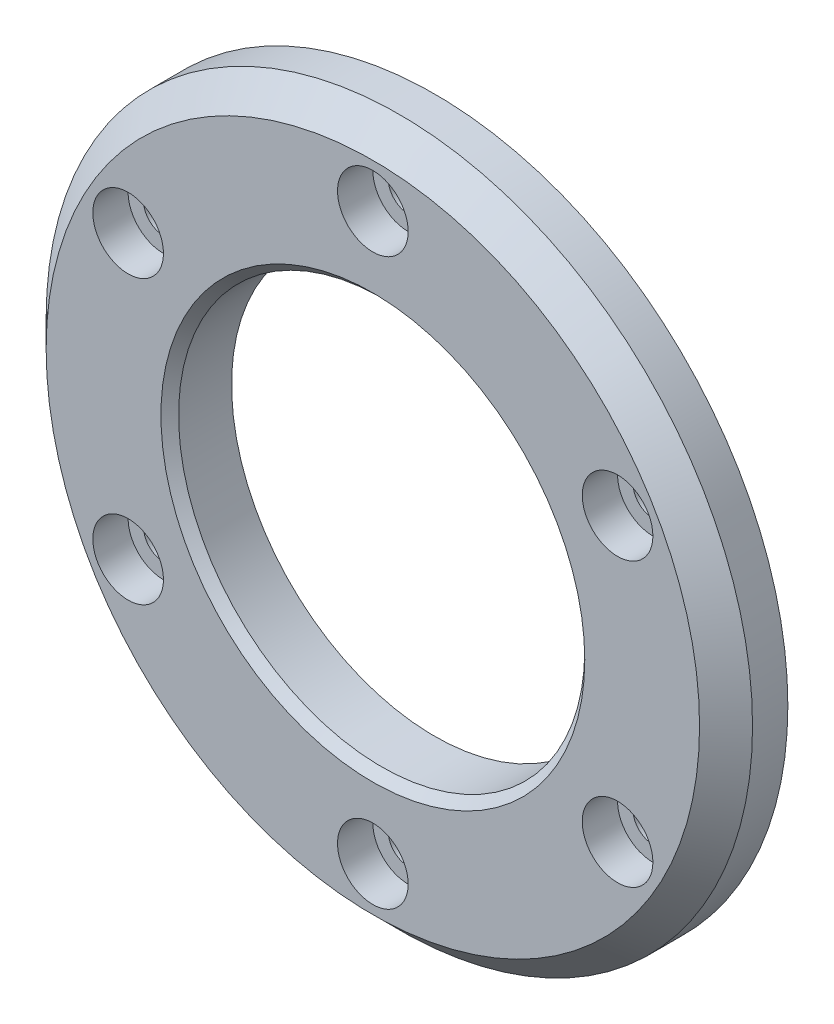
ISO-10303-21;
HEADER;
FILE_DESCRIPTION(('STEP AP214'),'2;1');
FILE_NAME('part.step','',(''),(''),'','','');
FILE_SCHEMA(('AUTOMOTIVE_DESIGN { 1 0 10303 214 1 1 1 1 }'));
ENDSEC;
DATA;
#1=APPLICATION_CONTEXT('core data for automotive mechanical design processes');
#2=APPLICATION_PROTOCOL_DEFINITION('international standard','automotive_design',2000,#1);
#3=PRODUCT_CONTEXT('',#1,'mechanical');
#4=PRODUCT('Part','Part','',(#3));
#5=PRODUCT_RELATED_PRODUCT_CATEGORY('part','',(#4));
#6=PRODUCT_DEFINITION_FORMATION('','',#4);
#7=PRODUCT_DEFINITION_CONTEXT('part definition',#1,'design');
#8=PRODUCT_DEFINITION('design','',#6,#7);
#9=PRODUCT_DEFINITION_SHAPE('','',#8);
#10=(LENGTH_UNIT() NAMED_UNIT(*) SI_UNIT(.MILLI.,.METRE.));
#11=(NAMED_UNIT(*) PLANE_ANGLE_UNIT() SI_UNIT($,.RADIAN.));
#12=(NAMED_UNIT(*) SI_UNIT($,.STERADIAN.) SOLID_ANGLE_UNIT());
#13=UNCERTAINTY_MEASURE_WITH_UNIT(LENGTH_MEASURE(1.E-05),#10,'distance_accuracy_value','');
#14=(GEOMETRIC_REPRESENTATION_CONTEXT(3) GLOBAL_UNCERTAINTY_ASSIGNED_CONTEXT((#13)) GLOBAL_UNIT_ASSIGNED_CONTEXT((#10,
#11,#12)) REPRESENTATION_CONTEXT('',''));
#15=CARTESIAN_POINT('',(0.,0.,0.));
#16=DIRECTION('',(0.,0.,1.));
#17=DIRECTION('',(1.,0.,0.));
#18=AXIS2_PLACEMENT_3D('',#15,#16,#17);
#19=CARTESIAN_POINT('',(0.,0.,3.));
#20=DIRECTION('',(0.,0.,1.));
#21=DIRECTION('',(1.,0.,0.));
#22=AXIS2_PLACEMENT_3D('',#19,#20,#21);
#23=PLANE('',#22);
#24=CARTESIAN_POINT('',(0.,32.,3.));
#25=DIRECTION('',(0.,0.,1.));
#26=DIRECTION('',(1.,0.,0.));
#27=AXIS2_PLACEMENT_3D('',#24,#25,#26);
#28=CIRCLE('',#27,4.);
#29=CARTESIAN_POINT('',(4.,32.,3.));
#30=VERTEX_POINT('',#29);
#31=EDGE_CURVE('E51',#30,#30,#28,.F.);
#32=ORIENTED_EDGE('',*,*,#31,.F.);
#33=EDGE_LOOP('',(#32));
#34=FACE_BOUND('',#33,.T.);
#35=CARTESIAN_POINT('',(0.,32.,3.));
#36=DIRECTION('',(0.,0.,1.));
#37=DIRECTION('',(1.,0.,0.));
#38=AXIS2_PLACEMENT_3D('',#35,#36,#37);
#39=CIRCLE('',#38,2.25);
#40=CARTESIAN_POINT('',(2.25,32.,3.));
#41=VERTEX_POINT('',#40);
#42=EDGE_CURVE('E72',#41,#41,#39,.T.);
#43=ORIENTED_EDGE('',*,*,#42,.F.);
#44=EDGE_LOOP('',(#43));
#45=FACE_BOUND('',#44,.T.);
#46=ADVANCED_FACE('F31',(#34,#45),#23,.T.);
#47=CARTESIAN_POINT('',(-27.712812921102,16.,3.));
#48=DIRECTION('',(0.,0.,1.));
#49=DIRECTION('',(1.,0.,0.));
#50=AXIS2_PLACEMENT_3D('',#47,#48,#49);
#51=CIRCLE('',#50,4.);
#52=CARTESIAN_POINT('',(-23.712812921102,16.,3.));
#53=VERTEX_POINT('',#52);
#54=EDGE_CURVE('E54',#53,#53,#51,.F.);
#55=ORIENTED_EDGE('',*,*,#54,.F.);
#56=EDGE_LOOP('',(#55));
#57=FACE_BOUND('',#56,.T.);
#58=CARTESIAN_POINT('',(-27.712812921102,16.,3.));
#59=DIRECTION('',(0.,0.,1.));
#60=DIRECTION('',(1.,0.,0.));
#61=AXIS2_PLACEMENT_3D('',#58,#59,#60);
#62=CIRCLE('',#61,2.25);
#63=CARTESIAN_POINT('',(-25.462812921102,16.,3.));
#64=VERTEX_POINT('',#63);
#65=EDGE_CURVE('E81',#64,#64,#62,.T.);
#66=ORIENTED_EDGE('',*,*,#65,.F.);
#67=EDGE_LOOP('',(#66));
#68=FACE_BOUND('',#67,.T.);
#69=ADVANCED_FACE('F185',(#57,#68),#23,.T.);
#70=CARTESIAN_POINT('',(-27.712812921102,-16.,3.));
#71=DIRECTION('',(0.,0.,1.));
#72=DIRECTION('',(1.,0.,0.));
#73=AXIS2_PLACEMENT_3D('',#70,#71,#72);
#74=CIRCLE('',#73,4.);
#75=CARTESIAN_POINT('',(-23.712812921102,-16.,3.));
#76=VERTEX_POINT('',#75);
#77=EDGE_CURVE('E57',#76,#76,#74,.F.);
#78=ORIENTED_EDGE('',*,*,#77,.F.);
#79=EDGE_LOOP('',(#78));
#80=FACE_BOUND('',#79,.T.);
#81=CARTESIAN_POINT('',(-27.712812921102,-16.,3.));
#82=DIRECTION('',(0.,0.,1.));
#83=DIRECTION('',(1.,0.,0.));
#84=AXIS2_PLACEMENT_3D('',#81,#82,#83);
#85=CIRCLE('',#84,2.25);
#86=CARTESIAN_POINT('',(-25.462812921102,-16.,3.));
#87=VERTEX_POINT('',#86);
#88=EDGE_CURVE('E85',#87,#87,#85,.T.);
#89=ORIENTED_EDGE('',*,*,#88,.F.);
#90=EDGE_LOOP('',(#89));
#91=FACE_BOUND('',#90,.T.);
#92=ADVANCED_FACE('F190',(#80,#91),#23,.T.);
#93=CARTESIAN_POINT('',(0.,-32.,3.));
#94=DIRECTION('',(0.,0.,1.));
#95=DIRECTION('',(1.,0.,0.));
#96=AXIS2_PLACEMENT_3D('',#93,#94,#95);
#97=CIRCLE('',#96,4.);
#98=CARTESIAN_POINT('',(4.,-32.,3.));
#99=VERTEX_POINT('',#98);
#100=EDGE_CURVE('E60',#99,#99,#97,.F.);
#101=ORIENTED_EDGE('',*,*,#100,.F.);
#102=EDGE_LOOP('',(#101));
#103=FACE_BOUND('',#102,.T.);
#104=CARTESIAN_POINT('',(0.,-32.,3.));
#105=DIRECTION('',(0.,0.,1.));
#106=DIRECTION('',(1.,0.,0.));
#107=AXIS2_PLACEMENT_3D('',#104,#105,#106);
#108=CIRCLE('',#107,2.25);
#109=CARTESIAN_POINT('',(2.25,-32.,3.));
#110=VERTEX_POINT('',#109);
#111=EDGE_CURVE('E91',#110,#110,#108,.T.);
#112=ORIENTED_EDGE('',*,*,#111,.F.);
#113=EDGE_LOOP('',(#112));
#114=FACE_BOUND('',#113,.T.);
#115=ADVANCED_FACE('F160',(#103,#114),#23,.T.);
#116=CARTESIAN_POINT('',(27.712812921102,-16.,3.));
#117=DIRECTION('',(0.,0.,1.));
#118=DIRECTION('',(1.,0.,0.));
#119=AXIS2_PLACEMENT_3D('',#116,#117,#118);
#120=CIRCLE('',#119,4.);
#121=CARTESIAN_POINT('',(31.712812921102,-16.,3.));
#122=VERTEX_POINT('',#121);
#123=EDGE_CURVE('E63',#122,#122,#120,.F.);
#124=ORIENTED_EDGE('',*,*,#123,.F.);
#125=EDGE_LOOP('',(#124));
#126=FACE_BOUND('',#125,.T.);
#127=CARTESIAN_POINT('',(27.712812921102,-16.,3.));
#128=DIRECTION('',(0.,0.,1.));
#129=DIRECTION('',(1.,0.,0.));
#130=AXIS2_PLACEMENT_3D('',#127,#128,#129);
#131=CIRCLE('',#130,2.25);
#132=CARTESIAN_POINT('',(29.962812921102,-16.,3.));
#133=VERTEX_POINT('',#132);
#134=EDGE_CURVE('E97',#133,#133,#131,.T.);
#135=ORIENTED_EDGE('',*,*,#134,.F.);
#136=EDGE_LOOP('',(#135));
#137=FACE_BOUND('',#136,.T.);
#138=ADVANCED_FACE('F156',(#126,#137),#23,.T.);
#139=CARTESIAN_POINT('',(27.712812921102,16.,3.));
#140=DIRECTION('',(0.,0.,1.));
#141=DIRECTION('',(1.,0.,0.));
#142=AXIS2_PLACEMENT_3D('',#139,#140,#141);
#143=CIRCLE('',#142,4.00000000000001);
#144=CARTESIAN_POINT('',(31.712812921102,16.,3.));
#145=VERTEX_POINT('',#144);
#146=EDGE_CURVE('E66',#145,#145,#143,.F.);
#147=ORIENTED_EDGE('',*,*,#146,.F.);
#148=EDGE_LOOP('',(#147));
#149=FACE_BOUND('',#148,.T.);
#150=CARTESIAN_POINT('',(27.712812921102,16.,3.));
#151=DIRECTION('',(0.,0.,1.));
#152=DIRECTION('',(1.,0.,0.));
#153=AXIS2_PLACEMENT_3D('',#150,#151,#152);
#154=CIRCLE('',#153,2.25);
#155=CARTESIAN_POINT('',(29.962812921102,16.,3.));
#156=VERTEX_POINT('',#155);
#157=EDGE_CURVE('E103',#156,#156,#154,.T.);
#158=ORIENTED_EDGE('',*,*,#157,.F.);
#159=EDGE_LOOP('',(#158));
#160=FACE_BOUND('',#159,.T.);
#161=ADVANCED_FACE('F159',(#149,#160),#23,.T.);
#162=CARTESIAN_POINT('',(0.,0.,0.));
#163=DIRECTION('',(0.,0.,1.));
#164=DIRECTION('',(1.,0.,0.));
#165=AXIS2_PLACEMENT_3D('',#162,#163,#164);
#166=PLANE('',#165);
#167=CARTESIAN_POINT('',(0.,0.,0.));
#168=DIRECTION('',(0.,0.,1.));
#169=DIRECTION('',(1.,0.,0.));
#170=AXIS2_PLACEMENT_3D('',#167,#168,#169);
#171=CIRCLE('',#170,40.);
#172=CARTESIAN_POINT('',(40.,0.,0.));
#173=VERTEX_POINT('',#172);
#174=EDGE_CURVE('E69',#173,#173,#171,.T.);
#175=ORIENTED_EDGE('',*,*,#174,.F.);
#176=EDGE_LOOP('',(#175));
#177=FACE_BOUND('',#176,.T.);
#178=CARTESIAN_POINT('',(0.,32.,0.));
#179=DIRECTION('',(0.,0.,1.));
#180=DIRECTION('',(1.,0.,0.));
#181=AXIS2_PLACEMENT_3D('',#178,#179,#180);
#182=CIRCLE('',#181,2.25);
#183=CARTESIAN_POINT('',(2.25,32.,0.));
#184=VERTEX_POINT('',#183);
#185=EDGE_CURVE('E73',#184,#184,#182,.T.);
#186=ORIENTED_EDGE('',*,*,#185,.T.);
#187=EDGE_LOOP('',(#186));
#188=FACE_BOUND('',#187,.T.);
#189=CARTESIAN_POINT('',(0.,0.,0.));
#190=DIRECTION('',(0.,0.,1.));
#191=DIRECTION('',(1.,0.,0.));
#192=AXIS2_PLACEMENT_3D('',#189,#190,#191);
#193=CIRCLE('',#192,23.);
#194=CARTESIAN_POINT('',(23.,0.,0.));
#195=VERTEX_POINT('',#194);
#196=EDGE_CURVE('E76',#195,#195,#193,.T.);
#197=ORIENTED_EDGE('',*,*,#196,.T.);
#198=EDGE_LOOP('',(#197));
#199=FACE_BOUND('',#198,.T.);
#200=CARTESIAN_POINT('',(-27.712812921102,16.,0.));
#201=DIRECTION('',(0.,0.,1.));
#202=DIRECTION('',(1.,0.,0.));
#203=AXIS2_PLACEMENT_3D('',#200,#201,#202);
#204=CIRCLE('',#203,2.25);
#205=CARTESIAN_POINT('',(-25.462812921102,16.,0.));
#206=VERTEX_POINT('',#205);
#207=EDGE_CURVE('E82',#206,#206,#204,.T.);
#208=ORIENTED_EDGE('',*,*,#207,.T.);
#209=EDGE_LOOP('',(#208));
#210=FACE_BOUND('',#209,.T.);
#211=CARTESIAN_POINT('',(-27.712812921102,-16.,0.));
#212=DIRECTION('',(0.,0.,1.));
#213=DIRECTION('',(1.,0.,0.));
#214=AXIS2_PLACEMENT_3D('',#211,#212,#213);
#215=CIRCLE('',#214,2.25);
#216=CARTESIAN_POINT('',(-25.462812921102,-16.,0.));
#217=VERTEX_POINT('',#216);
#218=EDGE_CURVE('E88',#217,#217,#215,.T.);
#219=ORIENTED_EDGE('',*,*,#218,.T.);
#220=EDGE_LOOP('',(#219));
#221=FACE_BOUND('',#220,.T.);
#222=CARTESIAN_POINT('',(0.,-32.,0.));
#223=DIRECTION('',(0.,0.,1.));
#224=DIRECTION('',(1.,0.,0.));
#225=AXIS2_PLACEMENT_3D('',#222,#223,#224);
#226=CIRCLE('',#225,2.25);
#227=CARTESIAN_POINT('',(2.25,-32.,0.));
#228=VERTEX_POINT('',#227);
#229=EDGE_CURVE('E94',#228,#228,#226,.T.);
#230=ORIENTED_EDGE('',*,*,#229,.T.);
#231=EDGE_LOOP('',(#230));
#232=FACE_BOUND('',#231,.T.);
#233=CARTESIAN_POINT('',(27.712812921102,-16.,0.));
#234=DIRECTION('',(0.,0.,1.));
#235=DIRECTION('',(1.,0.,0.));
#236=AXIS2_PLACEMENT_3D('',#233,#234,#235);
#237=CIRCLE('',#236,2.25);
#238=CARTESIAN_POINT('',(29.962812921102,-16.,0.));
#239=VERTEX_POINT('',#238);
#240=EDGE_CURVE('E100',#239,#239,#237,.T.);
#241=ORIENTED_EDGE('',*,*,#240,.T.);
#242=EDGE_LOOP('',(#241));
#243=FACE_BOUND('',#242,.T.);
#244=CARTESIAN_POINT('',(27.712812921102,16.,0.));
#245=DIRECTION('',(0.,0.,1.));
#246=DIRECTION('',(1.,0.,0.));
#247=AXIS2_PLACEMENT_3D('',#244,#245,#246);
#248=CIRCLE('',#247,2.25);
#249=CARTESIAN_POINT('',(29.962812921102,16.,0.));
#250=VERTEX_POINT('',#249);
#251=EDGE_CURVE('E106',#250,#250,#248,.T.);
#252=ORIENTED_EDGE('',*,*,#251,.T.);
#253=EDGE_LOOP('',(#252));
#254=FACE_BOUND('',#253,.T.);
#255=ADVANCED_FACE('F171',(#177,#188,#199,#210,#221,#232,#243,#254),#166,.F.);
#256=CARTESIAN_POINT('',(0.,0.,3.));
#257=DIRECTION('',(0.,0.,-1.));
#258=DIRECTION('',(-1.,0.,0.));
#259=AXIS2_PLACEMENT_3D('',#256,#257,#258);
#260=CYLINDRICAL_SURFACE('',#259,40.);
#261=CARTESIAN_POINT('',(0.,0.,3.99999999999996));
#262=DIRECTION('',(0.,0.,1.));
#263=DIRECTION('',(1.,0.,0.));
#264=AXIS2_PLACEMENT_3D('',#261,#262,#263);
#265=CIRCLE('',#264,40.);
#266=CARTESIAN_POINT('',(40.,0.,3.99999999999996));
#267=VERTEX_POINT('',#266);
#268=EDGE_CURVE('E42',#267,#267,#265,.F.);
#269=ORIENTED_EDGE('',*,*,#268,.T.);
#270=EDGE_LOOP('',(#269));
#271=FACE_BOUND('',#270,.T.);
#272=ORIENTED_EDGE('',*,*,#174,.T.);
#273=EDGE_LOOP('',(#272));
#274=FACE_BOUND('',#273,.T.);
#275=ADVANCED_FACE('F174',(#271,#274),#260,.T.);
#276=CARTESIAN_POINT('',(0.,32.,3.));
#277=DIRECTION('',(0.,0.,-1.));
#278=DIRECTION('',(-1.,0.,0.));
#279=AXIS2_PLACEMENT_3D('',#276,#277,#278);
#280=CYLINDRICAL_SURFACE('',#279,2.25);
#281=ORIENTED_EDGE('',*,*,#42,.T.);
#282=EDGE_LOOP('',(#281));
#283=FACE_BOUND('',#282,.T.);
#284=ORIENTED_EDGE('',*,*,#185,.F.);
#285=EDGE_LOOP('',(#284));
#286=FACE_BOUND('',#285,.T.);
#287=ADVANCED_FACE('F258',(#283,#286),#280,.F.);
#288=CARTESIAN_POINT('',(0.,0.,3.));
#289=DIRECTION('',(0.,0.,-1.));
#290=DIRECTION('',(-1.,0.,0.));
#291=AXIS2_PLACEMENT_3D('',#288,#289,#290);
#292=CYLINDRICAL_SURFACE('',#291,23.);
#293=CARTESIAN_POINT('',(0.,0.,5.99999999999997));
#294=DIRECTION('',(0.,0.,1.));
#295=DIRECTION('',(1.,0.,0.));
#296=AXIS2_PLACEMENT_3D('',#293,#294,#295);
#297=CIRCLE('',#296,23.);
#298=CARTESIAN_POINT('',(23.,0.,5.99999999999997));
#299=VERTEX_POINT('',#298);
#300=EDGE_CURVE('E38',#299,#299,#297,.T.);
#301=ORIENTED_EDGE('',*,*,#300,.T.);
#302=EDGE_LOOP('',(#301));
#303=FACE_BOUND('',#302,.T.);
#304=ORIENTED_EDGE('',*,*,#196,.F.);
#305=EDGE_LOOP('',(#304));
#306=FACE_BOUND('',#305,.T.);
#307=ADVANCED_FACE('F275',(#303,#306),#292,.F.);
#308=CARTESIAN_POINT('',(-27.712812921102,16.,3.));
#309=DIRECTION('',(0.,0.,-1.));
#310=DIRECTION('',(-1.,0.,0.));
#311=AXIS2_PLACEMENT_3D('',#308,#309,#310);
#312=CYLINDRICAL_SURFACE('',#311,2.25);
#313=ORIENTED_EDGE('',*,*,#65,.T.);
#314=EDGE_LOOP('',(#313));
#315=FACE_BOUND('',#314,.T.);
#316=ORIENTED_EDGE('',*,*,#207,.F.);
#317=EDGE_LOOP('',(#316));
#318=FACE_BOUND('',#317,.T.);
#319=ADVANCED_FACE('F278',(#315,#318),#312,.F.);
#320=CARTESIAN_POINT('',(-27.712812921102,-16.,3.));
#321=DIRECTION('',(0.,0.,-1.));
#322=DIRECTION('',(-1.,0.,0.));
#323=AXIS2_PLACEMENT_3D('',#320,#321,#322);
#324=CYLINDRICAL_SURFACE('',#323,2.25);
#325=ORIENTED_EDGE('',*,*,#88,.T.);
#326=EDGE_LOOP('',(#325));
#327=FACE_BOUND('',#326,.T.);
#328=ORIENTED_EDGE('',*,*,#218,.F.);
#329=EDGE_LOOP('',(#328));
#330=FACE_BOUND('',#329,.T.);
#331=ADVANCED_FACE('F309',(#327,#330),#324,.F.);
#332=CARTESIAN_POINT('',(0.,-32.,3.));
#333=DIRECTION('',(0.,0.,-1.));
#334=DIRECTION('',(-1.,0.,0.));
#335=AXIS2_PLACEMENT_3D('',#332,#333,#334);
#336=CYLINDRICAL_SURFACE('',#335,2.25);
#337=ORIENTED_EDGE('',*,*,#111,.T.);
#338=EDGE_LOOP('',(#337));
#339=FACE_BOUND('',#338,.T.);
#340=ORIENTED_EDGE('',*,*,#229,.F.);
#341=EDGE_LOOP('',(#340));
#342=FACE_BOUND('',#341,.T.);
#343=ADVANCED_FACE('F167',(#339,#342),#336,.F.);
#344=CARTESIAN_POINT('',(27.712812921102,-16.,3.));
#345=DIRECTION('',(0.,0.,-1.));
#346=DIRECTION('',(-1.,0.,0.));
#347=AXIS2_PLACEMENT_3D('',#344,#345,#346);
#348=CYLINDRICAL_SURFACE('',#347,2.25);
#349=ORIENTED_EDGE('',*,*,#134,.T.);
#350=EDGE_LOOP('',(#349));
#351=FACE_BOUND('',#350,.T.);
#352=ORIENTED_EDGE('',*,*,#240,.F.);
#353=EDGE_LOOP('',(#352));
#354=FACE_BOUND('',#353,.T.);
#355=ADVANCED_FACE('F164',(#351,#354),#348,.F.);
#356=CARTESIAN_POINT('',(27.712812921102,16.,3.));
#357=DIRECTION('',(0.,0.,-1.));
#358=DIRECTION('',(-1.,0.,0.));
#359=AXIS2_PLACEMENT_3D('',#356,#357,#358);
#360=CYLINDRICAL_SURFACE('',#359,2.25);
#361=ORIENTED_EDGE('',*,*,#157,.T.);
#362=EDGE_LOOP('',(#361));
#363=FACE_BOUND('',#362,.T.);
#364=ORIENTED_EDGE('',*,*,#251,.F.);
#365=EDGE_LOOP('',(#364));
#366=FACE_BOUND('',#365,.T.);
#367=ADVANCED_FACE('F137',(#363,#366),#360,.F.);
#368=CARTESIAN_POINT('',(0.,0.,7.));
#369=DIRECTION('',(0.,0.,1.));
#370=DIRECTION('',(1.,0.,0.));
#371=AXIS2_PLACEMENT_3D('',#368,#369,#370);
#372=PLANE('',#371);
#373=CARTESIAN_POINT('',(0.,0.,7.));
#374=DIRECTION('',(0.,0.,1.));
#375=DIRECTION('',(1.,0.,0.));
#376=AXIS2_PLACEMENT_3D('',#373,#374,#375);
#377=CIRCLE('',#376,24.);
#378=CARTESIAN_POINT('',(24.,0.,7.));
#379=VERTEX_POINT('',#378);
#380=EDGE_CURVE('E10',#379,#379,#377,.F.);
#381=ORIENTED_EDGE('',*,*,#380,.T.);
#382=EDGE_LOOP('',(#381));
#383=FACE_BOUND('',#382,.T.);
#384=CARTESIAN_POINT('',(0.,0.,7.));
#385=DIRECTION('',(0.,0.,1.));
#386=DIRECTION('',(1.,0.,0.));
#387=AXIS2_PLACEMENT_3D('',#384,#385,#386);
#388=CIRCLE('',#387,37.);
#389=CARTESIAN_POINT('',(37.,0.,7.));
#390=VERTEX_POINT('',#389);
#391=EDGE_CURVE('E46',#390,#390,#388,.T.);
#392=ORIENTED_EDGE('',*,*,#391,.T.);
#393=EDGE_LOOP('',(#392));
#394=FACE_BOUND('',#393,.T.);
#395=CARTESIAN_POINT('',(27.712812921102,16.,7.));
#396=DIRECTION('',(0.,0.,1.));
#397=DIRECTION('',(1.,0.,0.));
#398=AXIS2_PLACEMENT_3D('',#395,#396,#397);
#399=CIRCLE('',#398,4.00000000000001);
#400=CARTESIAN_POINT('',(31.712812921102,16.,7.));
#401=VERTEX_POINT('',#400);
#402=EDGE_CURVE('E126',#401,#401,#399,.T.);
#403=ORIENTED_EDGE('',*,*,#402,.F.);
#404=EDGE_LOOP('',(#403));
#405=FACE_BOUND('',#404,.T.);
#406=CARTESIAN_POINT('',(0.,-32.,7.));
#407=DIRECTION('',(0.,0.,1.));
#408=DIRECTION('',(1.,0.,0.));
#409=AXIS2_PLACEMENT_3D('',#406,#407,#408);
#410=CIRCLE('',#409,4.);
#411=CARTESIAN_POINT('',(4.,-32.,7.));
#412=VERTEX_POINT('',#411);
#413=EDGE_CURVE('E120',#412,#412,#410,.T.);
#414=ORIENTED_EDGE('',*,*,#413,.F.);
#415=EDGE_LOOP('',(#414));
#416=FACE_BOUND('',#415,.T.);
#417=CARTESIAN_POINT('',(-27.712812921102,16.,7.));
#418=DIRECTION('',(0.,0.,1.));
#419=DIRECTION('',(1.,0.,0.));
#420=AXIS2_PLACEMENT_3D('',#417,#418,#419);
#421=CIRCLE('',#420,4.);
#422=CARTESIAN_POINT('',(-23.712812921102,16.,7.));
#423=VERTEX_POINT('',#422);
#424=EDGE_CURVE('E114',#423,#423,#421,.T.);
#425=ORIENTED_EDGE('',*,*,#424,.F.);
#426=EDGE_LOOP('',(#425));
#427=FACE_BOUND('',#426,.T.);
#428=CARTESIAN_POINT('',(0.,32.,7.));
#429=DIRECTION('',(0.,0.,1.));
#430=DIRECTION('',(1.,0.,0.));
#431=AXIS2_PLACEMENT_3D('',#428,#429,#430);
#432=CIRCLE('',#431,4.);
#433=CARTESIAN_POINT('',(4.,32.,7.));
#434=VERTEX_POINT('',#433);
#435=EDGE_CURVE('E109',#434,#434,#432,.T.);
#436=ORIENTED_EDGE('',*,*,#435,.F.);
#437=EDGE_LOOP('',(#436));
#438=FACE_BOUND('',#437,.T.);
#439=CARTESIAN_POINT('',(-27.712812921102,-16.,7.));
#440=DIRECTION('',(0.,0.,1.));
#441=DIRECTION('',(1.,0.,0.));
#442=AXIS2_PLACEMENT_3D('',#439,#440,#441);
#443=CIRCLE('',#442,4.);
#444=CARTESIAN_POINT('',(-23.712812921102,-16.,7.));
#445=VERTEX_POINT('',#444);
#446=EDGE_CURVE('E117',#445,#445,#443,.T.);
#447=ORIENTED_EDGE('',*,*,#446,.F.);
#448=EDGE_LOOP('',(#447));
#449=FACE_BOUND('',#448,.T.);
#450=CARTESIAN_POINT('',(27.712812921102,-16.,7.));
#451=DIRECTION('',(0.,0.,1.));
#452=DIRECTION('',(1.,0.,0.));
#453=AXIS2_PLACEMENT_3D('',#450,#451,#452);
#454=CIRCLE('',#453,4.);
#455=CARTESIAN_POINT('',(31.712812921102,-16.,7.));
#456=VERTEX_POINT('',#455);
#457=EDGE_CURVE('E123',#456,#456,#454,.T.);
#458=ORIENTED_EDGE('',*,*,#457,.F.);
#459=EDGE_LOOP('',(#458));
#460=FACE_BOUND('',#459,.T.);
#461=ADVANCED_FACE('F133',(#383,#394,#405,#416,#427,#438,#449,#460),#372,.T.);
#462=CARTESIAN_POINT('',(0.,32.,7.));
#463=DIRECTION('',(0.,0.,-1.));
#464=DIRECTION('',(-1.,0.,0.));
#465=AXIS2_PLACEMENT_3D('',#462,#463,#464);
#466=CYLINDRICAL_SURFACE('',#465,4.);
#467=ORIENTED_EDGE('',*,*,#435,.T.);
#468=EDGE_LOOP('',(#467));
#469=FACE_BOUND('',#468,.T.);
#470=ORIENTED_EDGE('',*,*,#31,.T.);
#471=EDGE_LOOP('',(#470));
#472=FACE_BOUND('',#471,.T.);
#473=ADVANCED_FACE('F136',(#469,#472),#466,.F.);
#474=CARTESIAN_POINT('',(-27.712812921102,16.,7.));
#475=DIRECTION('',(0.,0.,-1.));
#476=DIRECTION('',(-1.,0.,0.));
#477=AXIS2_PLACEMENT_3D('',#474,#475,#476);
#478=CYLINDRICAL_SURFACE('',#477,4.);
#479=ORIENTED_EDGE('',*,*,#424,.T.);
#480=EDGE_LOOP('',(#479));
#481=FACE_BOUND('',#480,.T.);
#482=ORIENTED_EDGE('',*,*,#54,.T.);
#483=EDGE_LOOP('',(#482));
#484=FACE_BOUND('',#483,.T.);
#485=ADVANCED_FACE('F216',(#481,#484),#478,.F.);
#486=CARTESIAN_POINT('',(-27.712812921102,-16.,7.));
#487=DIRECTION('',(0.,0.,-1.));
#488=DIRECTION('',(-1.,0.,0.));
#489=AXIS2_PLACEMENT_3D('',#486,#487,#488);
#490=CYLINDRICAL_SURFACE('',#489,4.);
#491=ORIENTED_EDGE('',*,*,#446,.T.);
#492=EDGE_LOOP('',(#491));
#493=FACE_BOUND('',#492,.T.);
#494=ORIENTED_EDGE('',*,*,#77,.T.);
#495=EDGE_LOOP('',(#494));
#496=FACE_BOUND('',#495,.T.);
#497=ADVANCED_FACE('F212',(#493,#496),#490,.F.);
#498=CARTESIAN_POINT('',(0.,-32.,7.));
#499=DIRECTION('',(0.,0.,-1.));
#500=DIRECTION('',(-1.,0.,0.));
#501=AXIS2_PLACEMENT_3D('',#498,#499,#500);
#502=CYLINDRICAL_SURFACE('',#501,4.);
#503=ORIENTED_EDGE('',*,*,#413,.T.);
#504=EDGE_LOOP('',(#503));
#505=FACE_BOUND('',#504,.T.);
#506=ORIENTED_EDGE('',*,*,#100,.T.);
#507=EDGE_LOOP('',(#506));
#508=FACE_BOUND('',#507,.T.);
#509=ADVANCED_FACE('F152',(#505,#508),#502,.F.);
#510=CARTESIAN_POINT('',(27.712812921102,-16.,7.));
#511=DIRECTION('',(0.,0.,-1.));
#512=DIRECTION('',(-1.,0.,0.));
#513=AXIS2_PLACEMENT_3D('',#510,#511,#512);
#514=CYLINDRICAL_SURFACE('',#513,4.);
#515=ORIENTED_EDGE('',*,*,#457,.T.);
#516=EDGE_LOOP('',(#515));
#517=FACE_BOUND('',#516,.T.);
#518=ORIENTED_EDGE('',*,*,#123,.T.);
#519=EDGE_LOOP('',(#518));
#520=FACE_BOUND('',#519,.T.);
#521=ADVANCED_FACE('F149',(#517,#520),#514,.F.);
#522=CARTESIAN_POINT('',(27.712812921102,16.,7.));
#523=DIRECTION('',(0.,0.,-1.));
#524=DIRECTION('',(-1.,0.,0.));
#525=AXIS2_PLACEMENT_3D('',#522,#523,#524);
#526=CYLINDRICAL_SURFACE('',#525,4.00000000000001);
#527=ORIENTED_EDGE('',*,*,#402,.T.);
#528=EDGE_LOOP('',(#527));
#529=FACE_BOUND('',#528,.T.);
#530=ORIENTED_EDGE('',*,*,#146,.T.);
#531=EDGE_LOOP('',(#530));
#532=FACE_BOUND('',#531,.T.);
#533=ADVANCED_FACE('F130',(#529,#532),#526,.F.);
#534=CARTESIAN_POINT('',(0.,0.,7.));
#535=DIRECTION('',(0.,0.,-1.));
#536=DIRECTION('',(-1.,0.,0.));
#537=AXIS2_PLACEMENT_3D('',#534,#535,#536);
#538=CONICAL_SURFACE('',#537,37.,0.785398163397445);
#539=ORIENTED_EDGE('',*,*,#268,.F.);
#540=EDGE_LOOP('',(#539));
#541=FACE_BOUND('',#540,.T.);
#542=ORIENTED_EDGE('',*,*,#391,.F.);
#543=EDGE_LOOP('',(#542));
#544=FACE_BOUND('',#543,.T.);
#545=ADVANCED_FACE('F203',(#541,#544),#538,.T.);
#546=CARTESIAN_POINT('',(0.,0.,5.99999999999997));
#547=DIRECTION('',(0.,0.,1.));
#548=DIRECTION('',(1.,0.,0.));
#549=AXIS2_PLACEMENT_3D('',#546,#547,#548);
#550=CONICAL_SURFACE('',#549,23.,0.78539816339745);
#551=ORIENTED_EDGE('',*,*,#380,.F.);
#552=EDGE_LOOP('',(#551));
#553=FACE_BOUND('',#552,.T.);
#554=ORIENTED_EDGE('',*,*,#300,.F.);
#555=EDGE_LOOP('',(#554));
#556=FACE_BOUND('',#555,.T.);
#557=ADVANCED_FACE('F33',(#553,#556),#550,.F.);
#558=CLOSED_SHELL('',(#46,#69,#92,#115,#138,#161,#255,#275,#287,#307,#319,#331,#343,#355,#367,
#461,#473,#485,#497,#509,#521,#533,#545,#557));
#559=MANIFOLD_SOLID_BREP('B2',#558);
#560=ADVANCED_BREP_SHAPE_REPRESENTATION('',(#18,#559),#14);
#561=SHAPE_DEFINITION_REPRESENTATION(#9,#560);
ENDSEC;
END-ISO-10303-21;
